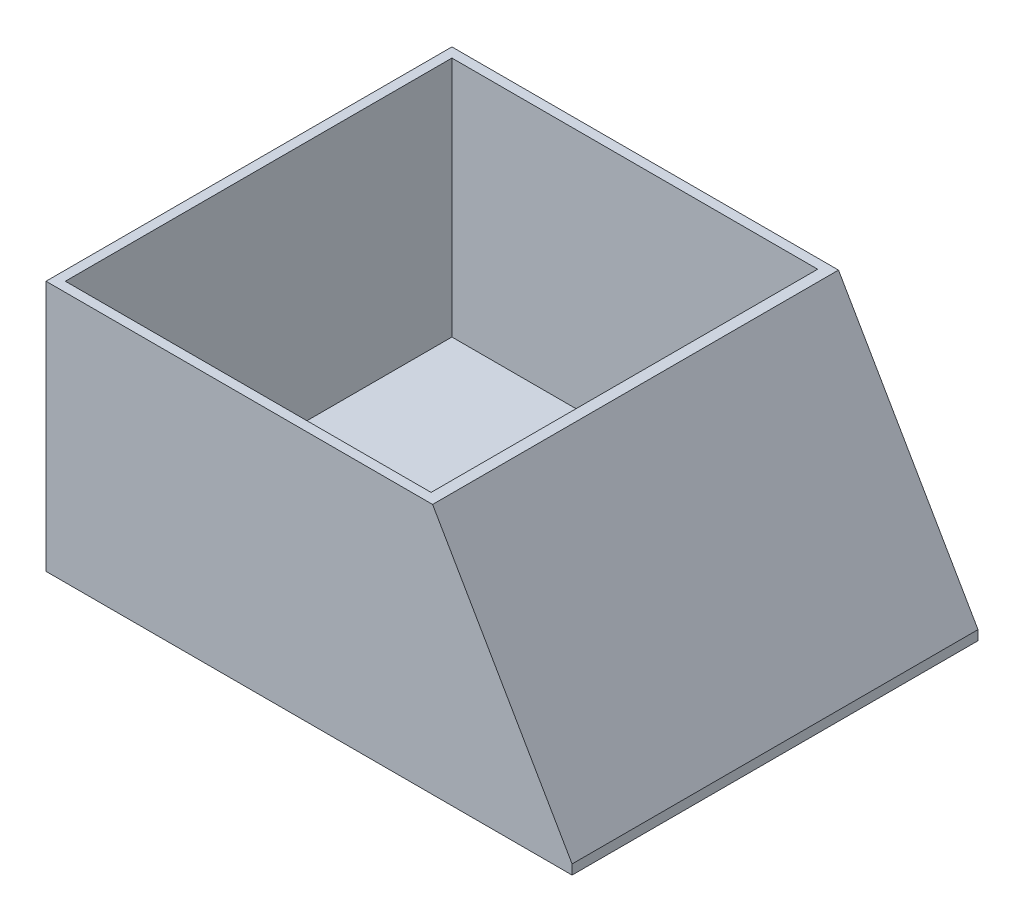
ISO-10303-21;
HEADER;
FILE_DESCRIPTION(('STEP AP214'),'2;1');
FILE_NAME('part.step','',(''),(''),'','','');
FILE_SCHEMA(('AUTOMOTIVE_DESIGN { 1 0 10303 214 1 1 1 1 }'));
ENDSEC;
DATA;
#1=APPLICATION_CONTEXT('core data for automotive mechanical design processes');
#2=APPLICATION_PROTOCOL_DEFINITION('international standard','automotive_design',2000,#1);
#3=PRODUCT_CONTEXT('',#1,'mechanical');
#4=PRODUCT('Part','Part','',(#3));
#5=PRODUCT_RELATED_PRODUCT_CATEGORY('part','',(#4));
#6=PRODUCT_DEFINITION_FORMATION('','',#4);
#7=PRODUCT_DEFINITION_CONTEXT('part definition',#1,'design');
#8=PRODUCT_DEFINITION('design','',#6,#7);
#9=PRODUCT_DEFINITION_SHAPE('','',#8);
#10=(LENGTH_UNIT() NAMED_UNIT(*) SI_UNIT(.MILLI.,.METRE.));
#11=(NAMED_UNIT(*) PLANE_ANGLE_UNIT() SI_UNIT($,.RADIAN.));
#12=(NAMED_UNIT(*) SI_UNIT($,.STERADIAN.) SOLID_ANGLE_UNIT());
#13=UNCERTAINTY_MEASURE_WITH_UNIT(LENGTH_MEASURE(1.E-05),#10,'distance_accuracy_value','');
#14=(GEOMETRIC_REPRESENTATION_CONTEXT(3) GLOBAL_UNCERTAINTY_ASSIGNED_CONTEXT((#13)) GLOBAL_UNIT_ASSIGNED_CONTEXT((#10,
#11,#12)) REPRESENTATION_CONTEXT('',''));
#15=CARTESIAN_POINT('',(0.,0.,0.));
#16=DIRECTION('',(0.,0.,1.));
#17=DIRECTION('',(1.,0.,0.));
#18=AXIS2_PLACEMENT_3D('',#15,#16,#17);
#19=CARTESIAN_POINT('',(0.,0.,240.973215823263));
#20=DIRECTION('',(1.,0.,0.));
#21=DIRECTION('',(0.,1.,0.));
#22=AXIS2_PLACEMENT_3D('',#19,#20,#21);
#23=PLANE('',#22);
#24=DIRECTION('',(0.,0.,-1.));
#25=VECTOR('',#24,1.);
#26=CARTESIAN_POINT('',(-1.35525271560688E-13,75.,240.973215823263));
#27=LINE('',#26,#25);
#28=CARTESIAN_POINT('',(-1.35525271560688E-13,75.,60.));
#29=VERTEX_POINT('',#28);
#30=CARTESIAN_POINT('',(-1.35525271560688E-13,75.,-60.));
#31=VERTEX_POINT('',#30);
#32=EDGE_CURVE('E62',#29,#31,#27,.T.);
#33=ORIENTED_EDGE('',*,*,#32,.F.);
#34=DIRECTION('',(0.,-1.,0.));
#35=VECTOR('',#34,1.);
#36=CARTESIAN_POINT('',(0.,0.,60.));
#37=LINE('',#36,#35);
#38=CARTESIAN_POINT('',(-1.35525271560688E-13,0.,60.));
#39=VERTEX_POINT('',#38);
#40=EDGE_CURVE('E66',#29,#39,#37,.T.);
#41=ORIENTED_EDGE('',*,*,#40,.T.);
#42=DIRECTION('',(0.,0.,-1.));
#43=VECTOR('',#42,1.);
#44=CARTESIAN_POINT('',(-1.35525271560688E-13,0.,240.973215823263));
#45=LINE('',#44,#43);
#46=CARTESIAN_POINT('',(-1.35525271560688E-13,0.,-60.));
#47=VERTEX_POINT('',#46);
#48=EDGE_CURVE('E37',#39,#47,#45,.T.);
#49=ORIENTED_EDGE('',*,*,#48,.T.);
#50=DIRECTION('',(0.,-1.,0.));
#51=VECTOR('',#50,1.);
#52=CARTESIAN_POINT('',(0.,0.,-60.));
#53=LINE('',#52,#51);
#54=EDGE_CURVE('E144',#31,#47,#53,.T.);
#55=ORIENTED_EDGE('',*,*,#54,.F.);
#56=EDGE_LOOP('',(#33,#41,#49,#55));
#57=FACE_BOUND('',#56,.T.);
#58=ADVANCED_FACE('F34',(#57),#23,.T.);
#59=CARTESIAN_POINT('',(0.,75.,240.973215823263));
#60=DIRECTION('',(0.,1.,0.));
#61=DIRECTION('',(0.,0.,1.));
#62=AXIS2_PLACEMENT_3D('',#59,#60,#61);
#63=PLANE('',#62);
#64=DIRECTION('',(0.,0.,-1.));
#65=VECTOR('',#64,1.);
#66=CARTESIAN_POINT('',(117.,75.,240.973215823263));
#67=LINE('',#66,#65);
#68=CARTESIAN_POINT('',(116.999999999962,74.9999999999886,63.));
#69=VERTEX_POINT('',#68);
#70=CARTESIAN_POINT('',(116.999999999962,74.9999999999886,-63.));
#71=VERTEX_POINT('',#70);
#72=EDGE_CURVE('E113',#69,#71,#67,.T.);
#73=ORIENTED_EDGE('',*,*,#72,.T.);
#74=DIRECTION('',(-1.,0.,0.));
#75=VECTOR('',#74,1.);
#76=CARTESIAN_POINT('',(-399969.618348931,74.9999999999886,-63.));
#77=LINE('',#76,#75);
#78=CARTESIAN_POINT('',(-2.99999999997122,74.9999999999886,-63.));
#79=VERTEX_POINT('',#78);
#80=EDGE_CURVE('E118',#71,#79,#77,.T.);
#81=ORIENTED_EDGE('',*,*,#80,.T.);
#82=DIRECTION('',(0.,0.,-1.));
#83=VECTOR('',#82,1.);
#84=CARTESIAN_POINT('',(-3.00000000000028,75.,240.973215823263));
#85=LINE('',#84,#83);
#86=CARTESIAN_POINT('',(-2.99999999997122,74.9999999999886,63.));
#87=VERTEX_POINT('',#86);
#88=EDGE_CURVE('E172',#87,#79,#85,.T.);
#89=ORIENTED_EDGE('',*,*,#88,.F.);
#90=DIRECTION('',(-1.,0.,0.));
#91=VECTOR('',#90,1.);
#92=CARTESIAN_POINT('',(-399969.618348931,74.9999999999886,63.));
#93=LINE('',#92,#91);
#94=EDGE_CURVE('E120',#69,#87,#93,.T.);
#95=ORIENTED_EDGE('',*,*,#94,.F.);
#96=EDGE_LOOP('',(#73,#81,#89,#95));
#97=FACE_BOUND('',#96,.T.);
#98=DIRECTION('',(-1.,0.,0.));
#99=VECTOR('',#98,1.);
#100=CARTESIAN_POINT('',(-399969.618348931,74.9999999999886,-60.));
#101=LINE('',#100,#99);
#102=CARTESIAN_POINT('',(113.535898384862,75.,-60.));
#103=VERTEX_POINT('',#102);
#104=EDGE_CURVE('E130',#103,#31,#101,.T.);
#105=ORIENTED_EDGE('',*,*,#104,.F.);
#106=DIRECTION('',(0.,0.,-1.));
#107=VECTOR('',#106,1.);
#108=CARTESIAN_POINT('',(113.535898384862,75.,240.973215823263));
#109=LINE('',#108,#107);
#110=CARTESIAN_POINT('',(113.535898384862,75.,60.));
#111=VERTEX_POINT('',#110);
#112=EDGE_CURVE('E123',#111,#103,#109,.T.);
#113=ORIENTED_EDGE('',*,*,#112,.F.);
#114=DIRECTION('',(-1.,0.,0.));
#115=VECTOR('',#114,1.);
#116=CARTESIAN_POINT('',(-399969.618348931,74.9999999999886,60.));
#117=LINE('',#116,#115);
#118=EDGE_CURVE('E154',#111,#29,#117,.T.);
#119=ORIENTED_EDGE('',*,*,#118,.T.);
#120=ORIENTED_EDGE('',*,*,#32,.T.);
#121=EDGE_LOOP('',(#105,#113,#119,#120));
#122=FACE_BOUND('',#121,.T.);
#123=ADVANCED_FACE('F115',(#97,#122),#63,.T.);
#124=CARTESIAN_POINT('',(-2.99999999999999,0.,240.973215823263));
#125=DIRECTION('',(-1.,0.,0.));
#126=DIRECTION('',(0.,-1.,0.));
#127=AXIS2_PLACEMENT_3D('',#124,#125,#126);
#128=PLANE('',#127);
#129=DIRECTION('',(0.,0.,-1.));
#130=VECTOR('',#129,1.);
#131=CARTESIAN_POINT('',(-2.99999999999999,-2.99999999999999,240.973215823263));
#132=LINE('',#131,#130);
#133=CARTESIAN_POINT('',(-2.9999999999859,-2.9999999999859,63.));
#134=VERTEX_POINT('',#133);
#135=CARTESIAN_POINT('',(-2.9999999999859,-2.9999999999859,-63.));
#136=VERTEX_POINT('',#135);
#137=EDGE_CURVE('E174',#134,#136,#132,.T.);
#138=ORIENTED_EDGE('',*,*,#137,.F.);
#139=DIRECTION('',(0.,1.,0.));
#140=VECTOR('',#139,1.);
#141=CARTESIAN_POINT('',(-2.99999999992906,-291547.35,63.));
#142=LINE('',#141,#140);
#143=EDGE_CURVE('E158',#134,#87,#142,.T.);
#144=ORIENTED_EDGE('',*,*,#143,.T.);
#145=ORIENTED_EDGE('',*,*,#88,.T.);
#146=DIRECTION('',(0.,1.,0.));
#147=VECTOR('',#146,1.);
#148=CARTESIAN_POINT('',(-2.99999999992906,-291547.35,-63.));
#149=LINE('',#148,#147);
#150=EDGE_CURVE('E136',#136,#79,#149,.T.);
#151=ORIENTED_EDGE('',*,*,#150,.F.);
#152=EDGE_LOOP('',(#138,#144,#145,#151));
#153=FACE_BOUND('',#152,.T.);
#154=ADVANCED_FACE('F206',(#153),#128,.T.);
#155=CARTESIAN_POINT('',(0.,-2.99999999999999,240.973215823263));
#156=DIRECTION('',(0.,1.,0.));
#157=DIRECTION('',(0.,0.,1.));
#158=AXIS2_PLACEMENT_3D('',#155,#156,#157);
#159=PLANE('',#158);
#160=DIRECTION('',(0.,0.,-1.));
#161=VECTOR('',#160,1.);
#162=CARTESIAN_POINT('',(160.301270189222,-2.99999999999999,240.973215823263));
#163=LINE('',#162,#161);
#164=CARTESIAN_POINT('',(160.301270189223,-2.9999999999859,63.));
#165=VERTEX_POINT('',#164);
#166=CARTESIAN_POINT('',(160.301270189223,-2.9999999999859,-63.));
#167=VERTEX_POINT('',#166);
#168=EDGE_CURVE('E176',#165,#167,#163,.T.);
#169=ORIENTED_EDGE('',*,*,#168,.F.);
#170=DIRECTION('',(-1.,0.,0.));
#171=VECTOR('',#170,1.);
#172=CARTESIAN_POINT('',(-399969.618348931,-2.9999999999859,63.));
#173=LINE('',#172,#171);
#174=EDGE_CURVE('E161',#165,#134,#173,.T.);
#175=ORIENTED_EDGE('',*,*,#174,.T.);
#176=ORIENTED_EDGE('',*,*,#137,.T.);
#177=DIRECTION('',(-1.,0.,0.));
#178=VECTOR('',#177,1.);
#179=CARTESIAN_POINT('',(-399969.618348931,-2.9999999999859,-63.));
#180=LINE('',#179,#178);
#181=EDGE_CURVE('E138',#167,#136,#180,.T.);
#182=ORIENTED_EDGE('',*,*,#181,.F.);
#183=EDGE_LOOP('',(#169,#175,#176,#182));
#184=FACE_BOUND('',#183,.T.);
#185=ADVANCED_FACE('F210',(#184),#159,.F.);
#186=CARTESIAN_POINT('',(160.301270189222,0.,240.973215823263));
#187=DIRECTION('',(-1.,0.,0.));
#188=DIRECTION('',(0.,0.,1.));
#189=AXIS2_PLACEMENT_3D('',#186,#187,#188);
#190=PLANE('',#189);
#191=DIRECTION('',(0.,0.,-1.));
#192=VECTOR('',#191,1.);
#193=CARTESIAN_POINT('',(160.301270189222,0.,240.973215823263));
#194=LINE('',#193,#192);
#195=CARTESIAN_POINT('',(160.301270189223,0.,63.));
#196=VERTEX_POINT('',#195);
#197=CARTESIAN_POINT('',(160.301270189223,0.,-63.));
#198=VERTEX_POINT('',#197);
#199=EDGE_CURVE('E74',#196,#198,#194,.T.);
#200=ORIENTED_EDGE('',*,*,#199,.F.);
#201=DIRECTION('',(0.,-1.,0.));
#202=VECTOR('',#201,1.);
#203=CARTESIAN_POINT('',(160.301270189223,-291547.35,63.));
#204=LINE('',#203,#202);
#205=EDGE_CURVE('E164',#196,#165,#204,.T.);
#206=ORIENTED_EDGE('',*,*,#205,.T.);
#207=ORIENTED_EDGE('',*,*,#168,.T.);
#208=DIRECTION('',(0.,-1.,0.));
#209=VECTOR('',#208,1.);
#210=CARTESIAN_POINT('',(160.301270189223,-291547.35,-63.));
#211=LINE('',#210,#209);
#212=EDGE_CURVE('E142',#198,#167,#211,.T.);
#213=ORIENTED_EDGE('',*,*,#212,.F.);
#214=EDGE_LOOP('',(#200,#206,#207,#213));
#215=FACE_BOUND('',#214,.T.);
#216=ADVANCED_FACE('F216',(#215),#190,.F.);
#217=CARTESIAN_POINT('',(120.225952641916,69.4124861213901,240.973215823263));
#218=DIRECTION('',(0.866025403784436,0.500000000000004,0.));
#219=DIRECTION('',(-0.500000000000004,0.866025403784436,0.));
#220=AXIS2_PLACEMENT_3D('',#217,#218,#219);
#221=PLANE('',#220);
#222=ORIENTED_EDGE('',*,*,#72,.F.);
#223=DIRECTION('',(-0.500000000000004,0.866025403784436,0.));
#224=VECTOR('',#223,1.);
#225=CARTESIAN_POINT('',(26371.5271184247,-45399.174897806,63.));
#226=LINE('',#225,#224);
#227=EDGE_CURVE('E155',#196,#69,#226,.T.);
#228=ORIENTED_EDGE('',*,*,#227,.F.);
#229=ORIENTED_EDGE('',*,*,#199,.T.);
#230=DIRECTION('',(-0.500000000000004,0.866025403784436,0.));
#231=VECTOR('',#230,1.);
#232=CARTESIAN_POINT('',(26371.5271184247,-45399.174897806,-63.));
#233=LINE('',#232,#231);
#234=EDGE_CURVE('E126',#198,#71,#233,.T.);
#235=ORIENTED_EDGE('',*,*,#234,.T.);
#236=EDGE_LOOP('',(#222,#228,#229,#235));
#237=FACE_BOUND('',#236,.T.);
#238=ADVANCED_FACE('F127',(#237),#221,.T.);
#239=CARTESIAN_POINT('',(117.627876430563,67.9124861213902,240.973215823263));
#240=DIRECTION('',(0.866025403784436,0.500000000000004,0.));
#241=DIRECTION('',(-0.500000000000004,0.866025403784436,0.));
#242=AXIS2_PLACEMENT_3D('',#239,#240,#241);
#243=PLANE('',#242);
#244=DIRECTION('',(0.500000000000004,-0.866025403784436,0.));
#245=VECTOR('',#244,1.);
#246=CARTESIAN_POINT('',(117.627876430563,67.9124861213902,60.));
#247=LINE('',#246,#245);
#248=CARTESIAN_POINT('',(156.837168574084,0.,60.));
#249=VERTEX_POINT('',#248);
#250=EDGE_CURVE('E43',#111,#249,#247,.T.);
#251=ORIENTED_EDGE('',*,*,#250,.F.);
#252=ORIENTED_EDGE('',*,*,#112,.T.);
#253=DIRECTION('',(0.500000000000004,-0.866025403784436,0.));
#254=VECTOR('',#253,1.);
#255=CARTESIAN_POINT('',(117.627876430563,67.9124861213902,-60.));
#256=LINE('',#255,#254);
#257=CARTESIAN_POINT('',(156.837168574084,0.,-60.));
#258=VERTEX_POINT('',#257);
#259=EDGE_CURVE('E147',#103,#258,#256,.T.);
#260=ORIENTED_EDGE('',*,*,#259,.T.);
#261=DIRECTION('',(0.,0.,-1.));
#262=VECTOR('',#261,1.);
#263=CARTESIAN_POINT('',(156.837168574084,0.,240.973215823263));
#264=LINE('',#263,#262);
#265=EDGE_CURVE('E51',#249,#258,#264,.T.);
#266=ORIENTED_EDGE('',*,*,#265,.F.);
#267=EDGE_LOOP('',(#251,#252,#260,#266));
#268=FACE_BOUND('',#267,.T.);
#269=ADVANCED_FACE('F186',(#268),#243,.F.);
#270=CARTESIAN_POINT('',(0.,0.,240.973215823263));
#271=DIRECTION('',(0.,-1.,0.));
#272=DIRECTION('',(1.,0.,0.));
#273=AXIS2_PLACEMENT_3D('',#270,#271,#272);
#274=PLANE('',#273);
#275=DIRECTION('',(-1.,0.,0.));
#276=VECTOR('',#275,1.);
#277=CARTESIAN_POINT('',(0.,0.,60.));
#278=LINE('',#277,#276);
#279=EDGE_CURVE('E11',#249,#39,#278,.T.);
#280=ORIENTED_EDGE('',*,*,#279,.F.);
#281=ORIENTED_EDGE('',*,*,#265,.T.);
#282=DIRECTION('',(-1.,0.,0.));
#283=VECTOR('',#282,1.);
#284=CARTESIAN_POINT('',(0.,0.,-60.));
#285=LINE('',#284,#283);
#286=EDGE_CURVE('E149',#258,#47,#285,.T.);
#287=ORIENTED_EDGE('',*,*,#286,.T.);
#288=ORIENTED_EDGE('',*,*,#48,.F.);
#289=EDGE_LOOP('',(#280,#281,#287,#288));
#290=FACE_BOUND('',#289,.T.);
#291=ADVANCED_FACE('F181',(#290),#274,.F.);
#292=CARTESIAN_POINT('',(0.,0.,63.));
#293=DIRECTION('',(0.,0.,1.));
#294=DIRECTION('',(1.,0.,0.));
#295=AXIS2_PLACEMENT_3D('',#292,#293,#294);
#296=PLANE('',#295);
#297=ORIENTED_EDGE('',*,*,#227,.T.);
#298=ORIENTED_EDGE('',*,*,#94,.T.);
#299=ORIENTED_EDGE('',*,*,#143,.F.);
#300=ORIENTED_EDGE('',*,*,#174,.F.);
#301=ORIENTED_EDGE('',*,*,#205,.F.);
#302=EDGE_LOOP('',(#297,#298,#299,#300,#301));
#303=FACE_BOUND('',#302,.T.);
#304=ADVANCED_FACE('F192',(#303),#296,.T.);
#305=CARTESIAN_POINT('',(0.,0.,60.));
#306=DIRECTION('',(0.,0.,1.));
#307=DIRECTION('',(1.,0.,0.));
#308=AXIS2_PLACEMENT_3D('',#305,#306,#307);
#309=PLANE('',#308);
#310=ORIENTED_EDGE('',*,*,#40,.F.);
#311=ORIENTED_EDGE('',*,*,#118,.F.);
#312=ORIENTED_EDGE('',*,*,#250,.T.);
#313=ORIENTED_EDGE('',*,*,#279,.T.);
#314=EDGE_LOOP('',(#310,#311,#312,#313));
#315=FACE_BOUND('',#314,.T.);
#316=ADVANCED_FACE('F190',(#315),#309,.F.);
#317=CARTESIAN_POINT('',(0.,0.,-63.));
#318=DIRECTION('',(0.,0.,-1.));
#319=DIRECTION('',(1.,0.,0.));
#320=AXIS2_PLACEMENT_3D('',#317,#318,#319);
#321=PLANE('',#320);
#322=ORIENTED_EDGE('',*,*,#234,.F.);
#323=ORIENTED_EDGE('',*,*,#212,.T.);
#324=ORIENTED_EDGE('',*,*,#181,.T.);
#325=ORIENTED_EDGE('',*,*,#150,.T.);
#326=ORIENTED_EDGE('',*,*,#80,.F.);
#327=EDGE_LOOP('',(#322,#323,#324,#325,#326));
#328=FACE_BOUND('',#327,.T.);
#329=ADVANCED_FACE('F133',(#328),#321,.T.);
#330=CARTESIAN_POINT('',(0.,0.,-60.));
#331=DIRECTION('',(0.,0.,-1.));
#332=DIRECTION('',(1.,0.,0.));
#333=AXIS2_PLACEMENT_3D('',#330,#331,#332);
#334=PLANE('',#333);
#335=ORIENTED_EDGE('',*,*,#54,.T.);
#336=ORIENTED_EDGE('',*,*,#286,.F.);
#337=ORIENTED_EDGE('',*,*,#259,.F.);
#338=ORIENTED_EDGE('',*,*,#104,.T.);
#339=EDGE_LOOP('',(#335,#336,#337,#338));
#340=FACE_BOUND('',#339,.T.);
#341=ADVANCED_FACE('F184',(#340),#334,.F.);
#342=CLOSED_SHELL('',(#58,#123,#154,#185,#216,#238,#269,#291,#304,#316,#329,#341));
#343=MANIFOLD_SOLID_BREP('B2',#342);
#344=ADVANCED_BREP_SHAPE_REPRESENTATION('',(#18,#343),#14);
#345=SHAPE_DEFINITION_REPRESENTATION(#9,#344);
ENDSEC;
END-ISO-10303-21;
